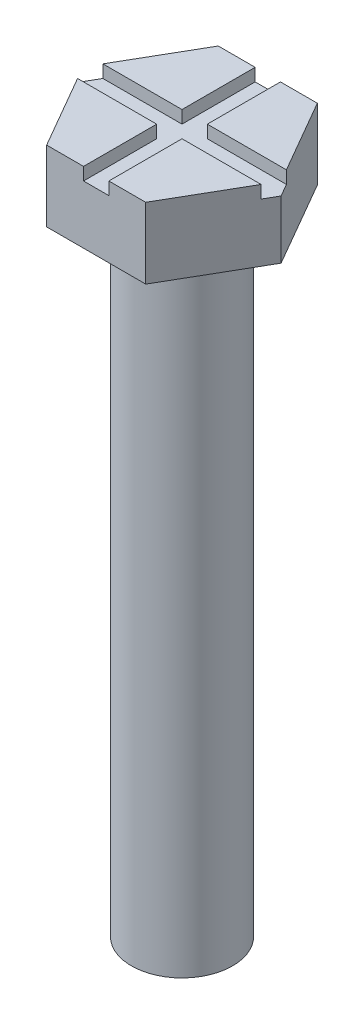
ISO-10303-21;
HEADER;
FILE_DESCRIPTION(('STEP AP214'),'2;1');
FILE_NAME('part.step','',(''),(''),'','','');
FILE_SCHEMA(('AUTOMOTIVE_DESIGN { 1 0 10303 214 1 1 1 1 }'));
ENDSEC;
DATA;
#1=APPLICATION_CONTEXT('core data for automotive mechanical design processes');
#2=APPLICATION_PROTOCOL_DEFINITION('international standard','automotive_design',2000,#1);
#3=PRODUCT_CONTEXT('',#1,'mechanical');
#4=PRODUCT('Part','Part','',(#3));
#5=PRODUCT_RELATED_PRODUCT_CATEGORY('part','',(#4));
#6=PRODUCT_DEFINITION_FORMATION('','',#4);
#7=PRODUCT_DEFINITION_CONTEXT('part definition',#1,'design');
#8=PRODUCT_DEFINITION('design','',#6,#7);
#9=PRODUCT_DEFINITION_SHAPE('','',#8);
#10=(LENGTH_UNIT() NAMED_UNIT(*) SI_UNIT(.MILLI.,.METRE.));
#11=(NAMED_UNIT(*) PLANE_ANGLE_UNIT() SI_UNIT($,.RADIAN.));
#12=(NAMED_UNIT(*) SI_UNIT($,.STERADIAN.) SOLID_ANGLE_UNIT());
#13=UNCERTAINTY_MEASURE_WITH_UNIT(LENGTH_MEASURE(1.E-05),#10,'distance_accuracy_value','');
#14=(GEOMETRIC_REPRESENTATION_CONTEXT(3) GLOBAL_UNCERTAINTY_ASSIGNED_CONTEXT((#13)) GLOBAL_UNIT_ASSIGNED_CONTEXT((#10,
#11,#12)) REPRESENTATION_CONTEXT('',''));
#15=CARTESIAN_POINT('',(0.,0.,0.));
#16=DIRECTION('',(0.,0.,1.));
#17=DIRECTION('',(1.,0.,0.));
#18=AXIS2_PLACEMENT_3D('',#15,#16,#17);
#19=CARTESIAN_POINT('',(0.,2.8,0.));
#20=DIRECTION('',(0.,1.,0.));
#21=DIRECTION('',(0.,0.,1.));
#22=AXIS2_PLACEMENT_3D('',#19,#20,#21);
#23=PLANE('',#22);
#24=DIRECTION('',(0.,0.,1.));
#25=VECTOR('',#24,1.);
#26=CARTESIAN_POINT('',(-0.5,2.8,0.5));
#27=LINE('',#26,#25);
#28=CARTESIAN_POINT('',(-0.5,2.8,0.5));
#29=VERTEX_POINT('',#28);
#30=CARTESIAN_POINT('',(-0.5,2.8,3.39));
#31=VERTEX_POINT('',#30);
#32=EDGE_CURVE('E201',#29,#31,#27,.T.);
#33=ORIENTED_EDGE('',*,*,#32,.F.);
#34=DIRECTION('',(1.,0.,0.));
#35=VECTOR('',#34,1.);
#36=CARTESIAN_POINT('',(0.,2.8,0.5));
#37=LINE('',#36,#35);
#38=CARTESIAN_POINT('',(-3.62575969051085,2.8,0.5));
#39=VERTEX_POINT('',#38);
#40=EDGE_CURVE('E359',#39,#29,#37,.T.);
#41=ORIENTED_EDGE('',*,*,#40,.F.);
#42=DIRECTION('',(0.5,0.,0.866025403784439));
#43=VECTOR('',#42,1.);
#44=CARTESIAN_POINT('',(-3.91443482510566,2.8,0.));
#45=LINE('',#44,#43);
#46=CARTESIAN_POINT('',(-1.95721741255283,2.8,3.39));
#47=VERTEX_POINT('',#46);
#48=EDGE_CURVE('E65',#39,#47,#45,.T.);
#49=ORIENTED_EDGE('',*,*,#48,.T.);
#50=DIRECTION('',(1.,0.,0.));
#51=VECTOR('',#50,1.);
#52=CARTESIAN_POINT('',(-1.95721741255283,2.8,3.39));
#53=LINE('',#52,#51);
#54=EDGE_CURVE('E297',#47,#31,#53,.T.);
#55=ORIENTED_EDGE('',*,*,#54,.T.);
#56=EDGE_LOOP('',(#33,#41,#49,#55));
#57=FACE_BOUND('',#56,.T.);
#58=ADVANCED_FACE('F39',(#57),#23,.T.);
#59=DIRECTION('',(-1.,0.,0.));
#60=VECTOR('',#59,1.);
#61=CARTESIAN_POINT('',(-3.91443482510566,2.8,-0.5));
#62=LINE('',#61,#60);
#63=CARTESIAN_POINT('',(-0.5,2.8,-0.5));
#64=VERTEX_POINT('',#63);
#65=CARTESIAN_POINT('',(-3.62575969051085,2.8,-0.5));
#66=VERTEX_POINT('',#65);
#67=EDGE_CURVE('E204',#64,#66,#62,.T.);
#68=ORIENTED_EDGE('',*,*,#67,.F.);
#69=DIRECTION('',(0.,0.,1.));
#70=VECTOR('',#69,1.);
#71=CARTESIAN_POINT('',(-0.5,2.8,-3.39));
#72=LINE('',#71,#70);
#73=CARTESIAN_POINT('',(-0.5,2.8,-3.39));
#74=VERTEX_POINT('',#73);
#75=EDGE_CURVE('E243',#74,#64,#72,.T.);
#76=ORIENTED_EDGE('',*,*,#75,.F.);
#77=DIRECTION('',(-1.,0.,0.));
#78=VECTOR('',#77,1.);
#79=CARTESIAN_POINT('',(1.95721741255283,2.8,-3.39));
#80=LINE('',#79,#78);
#81=CARTESIAN_POINT('',(-1.95721741255283,2.8,-3.39));
#82=VERTEX_POINT('',#81);
#83=EDGE_CURVE('E306',#74,#82,#80,.T.);
#84=ORIENTED_EDGE('',*,*,#83,.T.);
#85=DIRECTION('',(-0.5,0.,0.866025403784439));
#86=VECTOR('',#85,1.);
#87=CARTESIAN_POINT('',(-1.95721741255283,2.8,-3.39));
#88=LINE('',#87,#86);
#89=EDGE_CURVE('E311',#82,#66,#88,.T.);
#90=ORIENTED_EDGE('',*,*,#89,.T.);
#91=EDGE_LOOP('',(#68,#76,#84,#90));
#92=FACE_BOUND('',#91,.T.);
#93=ADVANCED_FACE('F415',(#92),#23,.T.);
#94=DIRECTION('',(0.,0.,-1.));
#95=VECTOR('',#94,1.);
#96=CARTESIAN_POINT('',(0.5,2.8,-3.39));
#97=LINE('',#96,#95);
#98=CARTESIAN_POINT('',(0.5,2.8,-0.5));
#99=VERTEX_POINT('',#98);
#100=CARTESIAN_POINT('',(0.5,2.8,-3.39));
#101=VERTEX_POINT('',#100);
#102=EDGE_CURVE('E240',#99,#101,#97,.T.);
#103=ORIENTED_EDGE('',*,*,#102,.F.);
#104=DIRECTION('',(-1.,0.,0.));
#105=VECTOR('',#104,1.);
#106=CARTESIAN_POINT('',(0.,2.8,-0.5));
#107=LINE('',#106,#105);
#108=CARTESIAN_POINT('',(3.62575969051085,2.8,-0.5));
#109=VERTEX_POINT('',#108);
#110=EDGE_CURVE('E357',#109,#99,#107,.T.);
#111=ORIENTED_EDGE('',*,*,#110,.F.);
#112=DIRECTION('',(-0.5,0.,-0.866025403784438));
#113=VECTOR('',#112,1.);
#114=CARTESIAN_POINT('',(3.91443482510566,2.8,0.));
#115=LINE('',#114,#113);
#116=CARTESIAN_POINT('',(1.95721741255283,2.8,-3.39));
#117=VERTEX_POINT('',#116);
#118=EDGE_CURVE('E303',#109,#117,#115,.T.);
#119=ORIENTED_EDGE('',*,*,#118,.T.);
#120=EDGE_CURVE('E307',#117,#101,#80,.T.);
#121=ORIENTED_EDGE('',*,*,#120,.T.);
#122=EDGE_LOOP('',(#103,#111,#119,#121));
#123=FACE_BOUND('',#122,.T.);
#124=ADVANCED_FACE('F394',(#123),#23,.T.);
#125=CARTESIAN_POINT('',(-1.95721741255283,2.8,3.39));
#126=DIRECTION('',(0.,0.,-1.));
#127=DIRECTION('',(-1.,0.,0.));
#128=AXIS2_PLACEMENT_3D('',#125,#126,#127);
#129=PLANE('',#128);
#130=CARTESIAN_POINT('',(0.5,2.8,3.39));
#131=VERTEX_POINT('',#130);
#132=CARTESIAN_POINT('',(1.95721741255283,2.8,3.39));
#133=VERTEX_POINT('',#132);
#134=EDGE_CURVE('E99',#131,#133,#53,.T.);
#135=ORIENTED_EDGE('',*,*,#134,.F.);
#136=DIRECTION('',(0.,1.,0.));
#137=VECTOR('',#136,1.);
#138=CARTESIAN_POINT('',(0.5,2.3,3.39));
#139=LINE('',#138,#137);
#140=CARTESIAN_POINT('',(0.5,2.3,3.39));
#141=VERTEX_POINT('',#140);
#142=EDGE_CURVE('E249',#141,#131,#139,.T.);
#143=ORIENTED_EDGE('',*,*,#142,.F.);
#144=DIRECTION('',(1.,0.,0.));
#145=VECTOR('',#144,1.);
#146=CARTESIAN_POINT('',(-0.5,2.3,3.39));
#147=LINE('',#146,#145);
#148=CARTESIAN_POINT('',(-0.5,2.3,3.39));
#149=VERTEX_POINT('',#148);
#150=EDGE_CURVE('E184',#149,#141,#147,.T.);
#151=ORIENTED_EDGE('',*,*,#150,.F.);
#152=DIRECTION('',(0.,1.,0.));
#153=VECTOR('',#152,1.);
#154=CARTESIAN_POINT('',(-0.5,2.3,3.39));
#155=LINE('',#154,#153);
#156=EDGE_CURVE('E252',#149,#31,#155,.T.);
#157=ORIENTED_EDGE('',*,*,#156,.T.);
#158=ORIENTED_EDGE('',*,*,#54,.F.);
#159=DIRECTION('',(0.,-1.,0.));
#160=VECTOR('',#159,1.);
#161=CARTESIAN_POINT('',(-1.95721741255283,2.8,3.39));
#162=LINE('',#161,#160);
#163=CARTESIAN_POINT('',(-1.95721741255283,0.,3.39));
#164=VERTEX_POINT('',#163);
#165=EDGE_CURVE('E317',#47,#164,#162,.T.);
#166=ORIENTED_EDGE('',*,*,#165,.T.);
#167=DIRECTION('',(1.,0.,0.));
#168=VECTOR('',#167,1.);
#169=CARTESIAN_POINT('',(-1.95721741255283,0.,3.39));
#170=LINE('',#169,#168);
#171=CARTESIAN_POINT('',(1.95721741255283,0.,3.39));
#172=VERTEX_POINT('',#171);
#173=EDGE_CURVE('E296',#164,#172,#170,.T.);
#174=ORIENTED_EDGE('',*,*,#173,.T.);
#175=DIRECTION('',(0.,-1.,0.));
#176=VECTOR('',#175,1.);
#177=CARTESIAN_POINT('',(1.95721741255283,2.8,3.39));
#178=LINE('',#177,#176);
#179=EDGE_CURVE('E353',#133,#172,#178,.T.);
#180=ORIENTED_EDGE('',*,*,#179,.F.);
#181=EDGE_LOOP('',(#135,#143,#151,#157,#158,#166,#174,#180));
#182=FACE_BOUND('',#181,.T.);
#183=ADVANCED_FACE('F41',(#182),#129,.F.);
#184=CARTESIAN_POINT('',(1.95721741255283,2.8,3.39));
#185=DIRECTION('',(-0.866025403784439,0.,-0.5));
#186=DIRECTION('',(-0.5,0.,0.866025403784439));
#187=AXIS2_PLACEMENT_3D('',#184,#185,#186);
#188=PLANE('',#187);
#189=DIRECTION('',(0.5,0.,-0.866025403784439));
#190=VECTOR('',#189,1.);
#191=CARTESIAN_POINT('',(1.95721741255283,2.3,3.39));
#192=LINE('',#191,#190);
#193=CARTESIAN_POINT('',(3.62575969051085,2.3,0.5));
#194=VERTEX_POINT('',#193);
#195=CARTESIAN_POINT('',(3.91443482510566,2.3,0.));
#196=VERTEX_POINT('',#195);
#197=EDGE_CURVE('E293',#194,#196,#192,.T.);
#198=ORIENTED_EDGE('',*,*,#197,.F.);
#199=DIRECTION('',(0.,1.,0.));
#200=VECTOR('',#199,1.);
#201=CARTESIAN_POINT('',(3.62575969051085,2.8,0.5));
#202=LINE('',#201,#200);
#203=CARTESIAN_POINT('',(3.62575969051085,2.8,0.5));
#204=VERTEX_POINT('',#203);
#205=EDGE_CURVE('E190',#194,#204,#202,.T.);
#206=ORIENTED_EDGE('',*,*,#205,.T.);
#207=DIRECTION('',(0.5,0.,-0.866025403784439));
#208=VECTOR('',#207,1.);
#209=CARTESIAN_POINT('',(1.95721741255283,2.8,3.39));
#210=LINE('',#209,#208);
#211=EDGE_CURVE('E300',#133,#204,#210,.T.);
#212=ORIENTED_EDGE('',*,*,#211,.F.);
#213=ORIENTED_EDGE('',*,*,#179,.T.);
#214=DIRECTION('',(0.5,0.,-0.866025403784439));
#215=VECTOR('',#214,1.);
#216=CARTESIAN_POINT('',(1.95721741255283,0.,3.39));
#217=LINE('',#216,#215);
#218=CARTESIAN_POINT('',(3.91443482510566,0.,0.));
#219=VERTEX_POINT('',#218);
#220=EDGE_CURVE('E321',#172,#219,#217,.T.);
#221=ORIENTED_EDGE('',*,*,#220,.T.);
#222=DIRECTION('',(0.,-1.,0.));
#223=VECTOR('',#222,1.);
#224=CARTESIAN_POINT('',(3.91443482510566,2.8,0.));
#225=LINE('',#224,#223);
#226=EDGE_CURVE('E350',#196,#219,#225,.T.);
#227=ORIENTED_EDGE('',*,*,#226,.F.);
#228=EDGE_LOOP('',(#198,#206,#212,#213,#221,#227));
#229=FACE_BOUND('',#228,.T.);
#230=ADVANCED_FACE('F380',(#229),#188,.F.);
#231=CARTESIAN_POINT('',(3.91443482510566,2.8,0.));
#232=DIRECTION('',(-0.866025403784438,0.,0.5));
#233=DIRECTION('',(0.5,0.,0.866025403784439));
#234=AXIS2_PLACEMENT_3D('',#231,#232,#233);
#235=PLANE('',#234);
#236=ORIENTED_EDGE('',*,*,#118,.F.);
#237=DIRECTION('',(0.,-1.,0.));
#238=VECTOR('',#237,1.);
#239=CARTESIAN_POINT('',(3.62575969051085,2.8,-0.5));
#240=LINE('',#239,#238);
#241=CARTESIAN_POINT('',(3.62575969051085,2.3,-0.500000000000001));
#242=VERTEX_POINT('',#241);
#243=EDGE_CURVE('E275',#109,#242,#240,.T.);
#244=ORIENTED_EDGE('',*,*,#243,.T.);
#245=DIRECTION('',(-0.5,0.,-0.866025403784439));
#246=VECTOR('',#245,1.);
#247=CARTESIAN_POINT('',(3.91443482510566,2.3,0.));
#248=LINE('',#247,#246);
#249=EDGE_CURVE('E290',#196,#242,#248,.T.);
#250=ORIENTED_EDGE('',*,*,#249,.F.);
#251=ORIENTED_EDGE('',*,*,#226,.T.);
#252=DIRECTION('',(-0.5,0.,-0.866025403784438));
#253=VECTOR('',#252,1.);
#254=CARTESIAN_POINT('',(3.91443482510566,0.,0.));
#255=LINE('',#254,#253);
#256=CARTESIAN_POINT('',(1.95721741255283,0.,-3.39));
#257=VERTEX_POINT('',#256);
#258=EDGE_CURVE('E325',#219,#257,#255,.T.);
#259=ORIENTED_EDGE('',*,*,#258,.T.);
#260=DIRECTION('',(0.,-1.,0.));
#261=VECTOR('',#260,1.);
#262=CARTESIAN_POINT('',(1.95721741255283,2.8,-3.39));
#263=LINE('',#262,#261);
#264=EDGE_CURVE('E346',#117,#257,#263,.T.);
#265=ORIENTED_EDGE('',*,*,#264,.F.);
#266=EDGE_LOOP('',(#236,#244,#250,#251,#259,#265));
#267=FACE_BOUND('',#266,.T.);
#268=ADVANCED_FACE('F386',(#267),#235,.F.);
#269=CARTESIAN_POINT('',(1.95721741255283,2.8,-3.39));
#270=DIRECTION('',(0.,0.,1.));
#271=DIRECTION('',(1.,0.,0.));
#272=AXIS2_PLACEMENT_3D('',#269,#270,#271);
#273=PLANE('',#272);
#274=ORIENTED_EDGE('',*,*,#83,.F.);
#275=DIRECTION('',(0.,1.,0.));
#276=VECTOR('',#275,1.);
#277=CARTESIAN_POINT('',(-0.5,2.3,-3.39));
#278=LINE('',#277,#276);
#279=CARTESIAN_POINT('',(-0.5,2.3,-3.39));
#280=VERTEX_POINT('',#279);
#281=EDGE_CURVE('E263',#280,#74,#278,.T.);
#282=ORIENTED_EDGE('',*,*,#281,.F.);
#283=DIRECTION('',(-1.,0.,0.));
#284=VECTOR('',#283,1.);
#285=CARTESIAN_POINT('',(-0.5,2.3,-3.39));
#286=LINE('',#285,#284);
#287=CARTESIAN_POINT('',(0.5,2.3,-3.39));
#288=VERTEX_POINT('',#287);
#289=EDGE_CURVE('E214',#288,#280,#286,.T.);
#290=ORIENTED_EDGE('',*,*,#289,.F.);
#291=DIRECTION('',(0.,1.,0.));
#292=VECTOR('',#291,1.);
#293=CARTESIAN_POINT('',(0.5,2.3,-3.39));
#294=LINE('',#293,#292);
#295=EDGE_CURVE('E266',#288,#101,#294,.T.);
#296=ORIENTED_EDGE('',*,*,#295,.T.);
#297=ORIENTED_EDGE('',*,*,#120,.F.);
#298=ORIENTED_EDGE('',*,*,#264,.T.);
#299=DIRECTION('',(-1.,0.,0.));
#300=VECTOR('',#299,1.);
#301=CARTESIAN_POINT('',(1.95721741255283,0.,-3.39));
#302=LINE('',#301,#300);
#303=CARTESIAN_POINT('',(-1.95721741255283,0.,-3.39));
#304=VERTEX_POINT('',#303);
#305=EDGE_CURVE('E328',#257,#304,#302,.T.);
#306=ORIENTED_EDGE('',*,*,#305,.T.);
#307=DIRECTION('',(0.,-1.,0.));
#308=VECTOR('',#307,1.);
#309=CARTESIAN_POINT('',(-1.95721741255283,2.8,-3.39));
#310=LINE('',#309,#308);
#311=EDGE_CURVE('E342',#82,#304,#310,.T.);
#312=ORIENTED_EDGE('',*,*,#311,.F.);
#313=EDGE_LOOP('',(#274,#282,#290,#296,#297,#298,#306,#312));
#314=FACE_BOUND('',#313,.T.);
#315=ADVANCED_FACE('F402',(#314),#273,.F.);
#316=CARTESIAN_POINT('',(-1.95721741255283,2.8,-3.39));
#317=DIRECTION('',(0.866025403784439,0.,0.5));
#318=DIRECTION('',(0.5,0.,-0.866025403784439));
#319=AXIS2_PLACEMENT_3D('',#316,#317,#318);
#320=PLANE('',#319);
#321=DIRECTION('',(-0.5,0.,0.866025403784439));
#322=VECTOR('',#321,1.);
#323=CARTESIAN_POINT('',(-1.95721741255283,2.3,-3.39));
#324=LINE('',#323,#322);
#325=CARTESIAN_POINT('',(-3.62575969051085,2.3,-0.5));
#326=VERTEX_POINT('',#325);
#327=CARTESIAN_POINT('',(-3.91443482510566,2.3,0.));
#328=VERTEX_POINT('',#327);
#329=EDGE_CURVE('E287',#326,#328,#324,.T.);
#330=ORIENTED_EDGE('',*,*,#329,.F.);
#331=DIRECTION('',(0.,1.,0.));
#332=VECTOR('',#331,1.);
#333=CARTESIAN_POINT('',(-3.62575969051085,2.8,-0.5));
#334=LINE('',#333,#332);
#335=EDGE_CURVE('E279',#326,#66,#334,.T.);
#336=ORIENTED_EDGE('',*,*,#335,.T.);
#337=ORIENTED_EDGE('',*,*,#89,.F.);
#338=ORIENTED_EDGE('',*,*,#311,.T.);
#339=DIRECTION('',(-0.5,0.,0.866025403784439));
#340=VECTOR('',#339,1.);
#341=CARTESIAN_POINT('',(-1.95721741255283,0.,-3.39));
#342=LINE('',#341,#340);
#343=CARTESIAN_POINT('',(-3.91443482510566,0.,0.));
#344=VERTEX_POINT('',#343);
#345=EDGE_CURVE('E331',#304,#344,#342,.T.);
#346=ORIENTED_EDGE('',*,*,#345,.T.);
#347=DIRECTION('',(0.,-1.,0.));
#348=VECTOR('',#347,1.);
#349=CARTESIAN_POINT('',(-3.91443482510566,2.8,0.));
#350=LINE('',#349,#348);
#351=EDGE_CURVE('E339',#328,#344,#350,.T.);
#352=ORIENTED_EDGE('',*,*,#351,.F.);
#353=EDGE_LOOP('',(#330,#336,#337,#338,#346,#352));
#354=FACE_BOUND('',#353,.T.);
#355=ADVANCED_FACE('F413',(#354),#320,.F.);
#356=CARTESIAN_POINT('',(-3.91443482510566,2.8,0.));
#357=DIRECTION('',(0.866025403784439,0.,-0.5));
#358=DIRECTION('',(-0.5,0.,-0.866025403784439));
#359=AXIS2_PLACEMENT_3D('',#356,#357,#358);
#360=PLANE('',#359);
#361=ORIENTED_EDGE('',*,*,#48,.F.);
#362=DIRECTION('',(0.,-1.,0.));
#363=VECTOR('',#362,1.);
#364=CARTESIAN_POINT('',(-3.62575969051085,2.8,0.5));
#365=LINE('',#364,#363);
#366=CARTESIAN_POINT('',(-3.62575969051085,2.3,0.5));
#367=VERTEX_POINT('',#366);
#368=EDGE_CURVE('E283',#39,#367,#365,.T.);
#369=ORIENTED_EDGE('',*,*,#368,.T.);
#370=DIRECTION('',(0.5,0.,0.866025403784439));
#371=VECTOR('',#370,1.);
#372=CARTESIAN_POINT('',(-3.91443482510566,2.3,0.));
#373=LINE('',#372,#371);
#374=EDGE_CURVE('E43',#328,#367,#373,.T.);
#375=ORIENTED_EDGE('',*,*,#374,.F.);
#376=ORIENTED_EDGE('',*,*,#351,.T.);
#377=DIRECTION('',(0.5,0.,0.866025403784439));
#378=VECTOR('',#377,1.);
#379=CARTESIAN_POINT('',(-3.91443482510566,0.,0.));
#380=LINE('',#379,#378);
#381=EDGE_CURVE('E92',#344,#164,#380,.T.);
#382=ORIENTED_EDGE('',*,*,#381,.T.);
#383=ORIENTED_EDGE('',*,*,#165,.F.);
#384=EDGE_LOOP('',(#361,#369,#375,#376,#382,#383));
#385=FACE_BOUND('',#384,.T.);
#386=ADVANCED_FACE('F370',(#385),#360,.F.);
#387=DIRECTION('',(0.,0.,-1.));
#388=VECTOR('',#387,1.);
#389=CARTESIAN_POINT('',(0.5,2.8,0.5));
#390=LINE('',#389,#388);
#391=CARTESIAN_POINT('',(0.5,2.8,0.5));
#392=VERTEX_POINT('',#391);
#393=EDGE_CURVE('E56',#131,#392,#390,.T.);
#394=ORIENTED_EDGE('',*,*,#393,.F.);
#395=ORIENTED_EDGE('',*,*,#134,.T.);
#396=ORIENTED_EDGE('',*,*,#211,.T.);
#397=DIRECTION('',(1.,0.,0.));
#398=VECTOR('',#397,1.);
#399=CARTESIAN_POINT('',(0.5,2.8,0.5));
#400=LINE('',#399,#398);
#401=EDGE_CURVE('E236',#392,#204,#400,.T.);
#402=ORIENTED_EDGE('',*,*,#401,.F.);
#403=EDGE_LOOP('',(#394,#395,#396,#402));
#404=FACE_BOUND('',#403,.T.);
#405=ADVANCED_FACE('F378',(#404),#23,.T.);
#406=CARTESIAN_POINT('',(0.,0.,0.));
#407=DIRECTION('',(0.,1.,0.));
#408=DIRECTION('',(0.,0.,1.));
#409=AXIS2_PLACEMENT_3D('',#406,#407,#408);
#410=PLANE('',#409);
#411=CARTESIAN_POINT('',(0.,0.,0.));
#412=DIRECTION('',(0.,-1.,0.));
#413=DIRECTION('',(0.,0.,-1.));
#414=AXIS2_PLACEMENT_3D('',#411,#412,#413);
#415=CIRCLE('',#414,2.);
#416=CARTESIAN_POINT('',(0.,0.,-2.));
#417=VERTEX_POINT('',#416);
#418=EDGE_CURVE('E11',#417,#417,#415,.T.);
#419=ORIENTED_EDGE('',*,*,#418,.F.);
#420=EDGE_LOOP('',(#419));
#421=FACE_BOUND('',#420,.T.);
#422=ORIENTED_EDGE('',*,*,#173,.F.);
#423=ORIENTED_EDGE('',*,*,#381,.F.);
#424=ORIENTED_EDGE('',*,*,#345,.F.);
#425=ORIENTED_EDGE('',*,*,#305,.F.);
#426=ORIENTED_EDGE('',*,*,#258,.F.);
#427=ORIENTED_EDGE('',*,*,#220,.F.);
#428=EDGE_LOOP('',(#422,#423,#424,#425,#426,#427));
#429=FACE_BOUND('',#428,.T.);
#430=ADVANCED_FACE('F421',(#421,#429),#410,.F.);
#431=CARTESIAN_POINT('',(0.,2.3,0.));
#432=DIRECTION('',(0.,1.,0.));
#433=DIRECTION('',(0.,0.,1.));
#434=AXIS2_PLACEMENT_3D('',#431,#432,#433);
#435=PLANE('',#434);
#436=ORIENTED_EDGE('',*,*,#197,.T.);
#437=ORIENTED_EDGE('',*,*,#249,.T.);
#438=DIRECTION('',(-1.,0.,0.));
#439=VECTOR('',#438,1.);
#440=CARTESIAN_POINT('',(0.5,2.3,-0.5));
#441=LINE('',#440,#439);
#442=CARTESIAN_POINT('',(0.5,2.3,-0.5));
#443=VERTEX_POINT('',#442);
#444=EDGE_CURVE('E194',#242,#443,#441,.T.);
#445=ORIENTED_EDGE('',*,*,#444,.T.);
#446=DIRECTION('',(0.,0.,-1.));
#447=VECTOR('',#446,1.);
#448=CARTESIAN_POINT('',(0.5,2.3,-3.39));
#449=LINE('',#448,#447);
#450=EDGE_CURVE('E210',#443,#288,#449,.T.);
#451=ORIENTED_EDGE('',*,*,#450,.T.);
#452=ORIENTED_EDGE('',*,*,#289,.T.);
#453=DIRECTION('',(0.,0.,1.));
#454=VECTOR('',#453,1.);
#455=CARTESIAN_POINT('',(-0.5,2.3,-3.39));
#456=LINE('',#455,#454);
#457=CARTESIAN_POINT('',(-0.5,2.3,-0.5));
#458=VERTEX_POINT('',#457);
#459=EDGE_CURVE('E218',#280,#458,#456,.T.);
#460=ORIENTED_EDGE('',*,*,#459,.T.);
#461=DIRECTION('',(-1.,0.,0.));
#462=VECTOR('',#461,1.);
#463=CARTESIAN_POINT('',(-3.91443482510566,2.3,-0.5));
#464=LINE('',#463,#462);
#465=EDGE_CURVE('E222',#458,#326,#464,.T.);
#466=ORIENTED_EDGE('',*,*,#465,.T.);
#467=ORIENTED_EDGE('',*,*,#329,.T.);
#468=ORIENTED_EDGE('',*,*,#374,.T.);
#469=DIRECTION('',(1.,0.,0.));
#470=VECTOR('',#469,1.);
#471=CARTESIAN_POINT('',(-3.91443482510566,2.3,0.5));
#472=LINE('',#471,#470);
#473=CARTESIAN_POINT('',(-0.5,2.3,0.5));
#474=VERTEX_POINT('',#473);
#475=EDGE_CURVE('E226',#367,#474,#472,.T.);
#476=ORIENTED_EDGE('',*,*,#475,.T.);
#477=DIRECTION('',(0.,0.,1.));
#478=VECTOR('',#477,1.);
#479=CARTESIAN_POINT('',(-0.5,2.3,0.5));
#480=LINE('',#479,#478);
#481=EDGE_CURVE('E229',#474,#149,#480,.T.);
#482=ORIENTED_EDGE('',*,*,#481,.T.);
#483=ORIENTED_EDGE('',*,*,#150,.T.);
#484=DIRECTION('',(0.,0.,-1.));
#485=VECTOR('',#484,1.);
#486=CARTESIAN_POINT('',(0.5,2.3,0.5));
#487=LINE('',#486,#485);
#488=CARTESIAN_POINT('',(0.5,2.3,0.5));
#489=VERTEX_POINT('',#488);
#490=EDGE_CURVE('E178',#141,#489,#487,.T.);
#491=ORIENTED_EDGE('',*,*,#490,.T.);
#492=DIRECTION('',(1.,0.,0.));
#493=VECTOR('',#492,1.);
#494=CARTESIAN_POINT('',(0.5,2.3,0.5));
#495=LINE('',#494,#493);
#496=EDGE_CURVE('E187',#489,#194,#495,.T.);
#497=ORIENTED_EDGE('',*,*,#496,.T.);
#498=EDGE_LOOP('',(#436,#437,#445,#451,#452,#460,#466,#467,#468,#476,#482,#483,#491,#497));
#499=FACE_BOUND('',#498,.T.);
#500=ADVANCED_FACE('F196',(#499),#435,.T.);
#501=CARTESIAN_POINT('',(-3.91443482510566,2.3,0.5));
#502=DIRECTION('',(0.,0.,1.));
#503=DIRECTION('',(1.,0.,0.));
#504=AXIS2_PLACEMENT_3D('',#501,#502,#503);
#505=PLANE('',#504);
#506=ORIENTED_EDGE('',*,*,#40,.T.);
#507=DIRECTION('',(0.,1.,0.));
#508=VECTOR('',#507,1.);
#509=CARTESIAN_POINT('',(-0.5,2.3,0.5));
#510=LINE('',#509,#508);
#511=EDGE_CURVE('E256',#474,#29,#510,.T.);
#512=ORIENTED_EDGE('',*,*,#511,.F.);
#513=ORIENTED_EDGE('',*,*,#475,.F.);
#514=ORIENTED_EDGE('',*,*,#368,.F.);
#515=EDGE_LOOP('',(#506,#512,#513,#514));
#516=FACE_BOUND('',#515,.T.);
#517=ADVANCED_FACE('F368',(#516),#505,.F.);
#518=CARTESIAN_POINT('',(-3.91443482510566,2.3,-0.5));
#519=DIRECTION('',(0.,0.,-1.));
#520=DIRECTION('',(-1.,0.,0.));
#521=AXIS2_PLACEMENT_3D('',#518,#519,#520);
#522=PLANE('',#521);
#523=ORIENTED_EDGE('',*,*,#465,.F.);
#524=DIRECTION('',(0.,1.,0.));
#525=VECTOR('',#524,1.);
#526=CARTESIAN_POINT('',(-0.5,2.3,-0.5));
#527=LINE('',#526,#525);
#528=EDGE_CURVE('E260',#458,#64,#527,.T.);
#529=ORIENTED_EDGE('',*,*,#528,.T.);
#530=ORIENTED_EDGE('',*,*,#67,.T.);
#531=ORIENTED_EDGE('',*,*,#335,.F.);
#532=EDGE_LOOP('',(#523,#529,#530,#531));
#533=FACE_BOUND('',#532,.T.);
#534=ADVANCED_FACE('F410',(#533),#522,.F.);
#535=CARTESIAN_POINT('',(0.5,2.3,-0.5));
#536=DIRECTION('',(0.,0.,-1.));
#537=DIRECTION('',(-1.,0.,0.));
#538=AXIS2_PLACEMENT_3D('',#535,#536,#537);
#539=PLANE('',#538);
#540=ORIENTED_EDGE('',*,*,#110,.T.);
#541=DIRECTION('',(0.,1.,0.));
#542=VECTOR('',#541,1.);
#543=CARTESIAN_POINT('',(0.5,2.3,-0.5));
#544=LINE('',#543,#542);
#545=EDGE_CURVE('E183',#443,#99,#544,.T.);
#546=ORIENTED_EDGE('',*,*,#545,.F.);
#547=ORIENTED_EDGE('',*,*,#444,.F.);
#548=ORIENTED_EDGE('',*,*,#243,.F.);
#549=EDGE_LOOP('',(#540,#546,#547,#548));
#550=FACE_BOUND('',#549,.T.);
#551=ADVANCED_FACE('F390',(#550),#539,.F.);
#552=CARTESIAN_POINT('',(0.5,2.3,0.5));
#553=DIRECTION('',(0.,0.,1.));
#554=DIRECTION('',(1.,0.,0.));
#555=AXIS2_PLACEMENT_3D('',#552,#553,#554);
#556=PLANE('',#555);
#557=ORIENTED_EDGE('',*,*,#496,.F.);
#558=DIRECTION('',(0.,1.,0.));
#559=VECTOR('',#558,1.);
#560=CARTESIAN_POINT('',(0.5,2.3,0.5));
#561=LINE('',#560,#559);
#562=EDGE_CURVE('E174',#489,#392,#561,.T.);
#563=ORIENTED_EDGE('',*,*,#562,.T.);
#564=ORIENTED_EDGE('',*,*,#401,.T.);
#565=ORIENTED_EDGE('',*,*,#205,.F.);
#566=EDGE_LOOP('',(#557,#563,#564,#565));
#567=FACE_BOUND('',#566,.T.);
#568=ADVANCED_FACE('F188',(#567),#556,.F.);
#569=CARTESIAN_POINT('',(0.5,2.3,0.5));
#570=DIRECTION('',(1.,0.,0.));
#571=DIRECTION('',(0.,0.,-1.));
#572=AXIS2_PLACEMENT_3D('',#569,#570,#571);
#573=PLANE('',#572);
#574=ORIENTED_EDGE('',*,*,#393,.T.);
#575=ORIENTED_EDGE('',*,*,#562,.F.);
#576=ORIENTED_EDGE('',*,*,#490,.F.);
#577=ORIENTED_EDGE('',*,*,#142,.T.);
#578=EDGE_LOOP('',(#574,#575,#576,#577));
#579=FACE_BOUND('',#578,.T.);
#580=ADVANCED_FACE('F176',(#579),#573,.F.);
#581=CARTESIAN_POINT('',(-0.5,2.3,0.5));
#582=DIRECTION('',(-1.,0.,0.));
#583=DIRECTION('',(0.,0.,1.));
#584=AXIS2_PLACEMENT_3D('',#581,#582,#583);
#585=PLANE('',#584);
#586=ORIENTED_EDGE('',*,*,#32,.T.);
#587=ORIENTED_EDGE('',*,*,#156,.F.);
#588=ORIENTED_EDGE('',*,*,#481,.F.);
#589=ORIENTED_EDGE('',*,*,#511,.T.);
#590=EDGE_LOOP('',(#586,#587,#588,#589));
#591=FACE_BOUND('',#590,.T.);
#592=ADVANCED_FACE('F376',(#591),#585,.F.);
#593=CARTESIAN_POINT('',(-0.5,2.3,-3.39));
#594=DIRECTION('',(-1.,0.,0.));
#595=DIRECTION('',(0.,0.,1.));
#596=AXIS2_PLACEMENT_3D('',#593,#594,#595);
#597=PLANE('',#596);
#598=ORIENTED_EDGE('',*,*,#75,.T.);
#599=ORIENTED_EDGE('',*,*,#528,.F.);
#600=ORIENTED_EDGE('',*,*,#459,.F.);
#601=ORIENTED_EDGE('',*,*,#281,.T.);
#602=EDGE_LOOP('',(#598,#599,#600,#601));
#603=FACE_BOUND('',#602,.T.);
#604=ADVANCED_FACE('F406',(#603),#597,.F.);
#605=CARTESIAN_POINT('',(0.5,2.3,-3.39));
#606=DIRECTION('',(1.,0.,0.));
#607=DIRECTION('',(0.,0.,-1.));
#608=AXIS2_PLACEMENT_3D('',#605,#606,#607);
#609=PLANE('',#608);
#610=ORIENTED_EDGE('',*,*,#102,.T.);
#611=ORIENTED_EDGE('',*,*,#295,.F.);
#612=ORIENTED_EDGE('',*,*,#450,.F.);
#613=ORIENTED_EDGE('',*,*,#545,.T.);
#614=EDGE_LOOP('',(#610,#611,#612,#613));
#615=FACE_BOUND('',#614,.T.);
#616=ADVANCED_FACE('F397',(#615),#609,.F.);
#617=CARTESIAN_POINT('',(0.,-25.,0.));
#618=DIRECTION('',(0.,1.,0.));
#619=DIRECTION('',(0.,0.,1.));
#620=AXIS2_PLACEMENT_3D('',#617,#618,#619);
#621=CYLINDRICAL_SURFACE('',#620,2.);
#622=CARTESIAN_POINT('',(0.,-25.,0.));
#623=DIRECTION('',(0.,-1.,0.));
#624=DIRECTION('',(0.,0.,-1.));
#625=AXIS2_PLACEMENT_3D('',#622,#623,#624);
#626=CIRCLE('',#625,2.);
#627=CARTESIAN_POINT('',(0.,-25.,-2.));
#628=VERTEX_POINT('',#627);
#629=EDGE_CURVE('E237',#628,#628,#626,.T.);
#630=ORIENTED_EDGE('',*,*,#629,.F.);
#631=EDGE_LOOP('',(#630));
#632=FACE_BOUND('',#631,.T.);
#633=ORIENTED_EDGE('',*,*,#418,.T.);
#634=EDGE_LOOP('',(#633));
#635=FACE_BOUND('',#634,.T.);
#636=ADVANCED_FACE('F447',(#632,#635),#621,.T.);
#637=CARTESIAN_POINT('',(0.,-25.,0.));
#638=DIRECTION('',(0.,-1.,0.));
#639=DIRECTION('',(0.,0.,-1.));
#640=AXIS2_PLACEMENT_3D('',#637,#638,#639);
#641=PLANE('',#640);
#642=ORIENTED_EDGE('',*,*,#629,.T.);
#643=EDGE_LOOP('',(#642));
#644=FACE_BOUND('',#643,.T.);
#645=ADVANCED_FACE('F458',(#644),#641,.T.);
#646=CLOSED_SHELL('',(#58,#93,#124,#183,#230,#268,#315,#355,#386,#405,#430,#500,#517,#534,#551,
#568,#580,#592,#604,#616,#636,#645));
#647=MANIFOLD_SOLID_BREP('B2',#646);
#648=ADVANCED_BREP_SHAPE_REPRESENTATION('',(#18,#647),#14);
#649=SHAPE_DEFINITION_REPRESENTATION(#9,#648);
ENDSEC;
END-ISO-10303-21;
